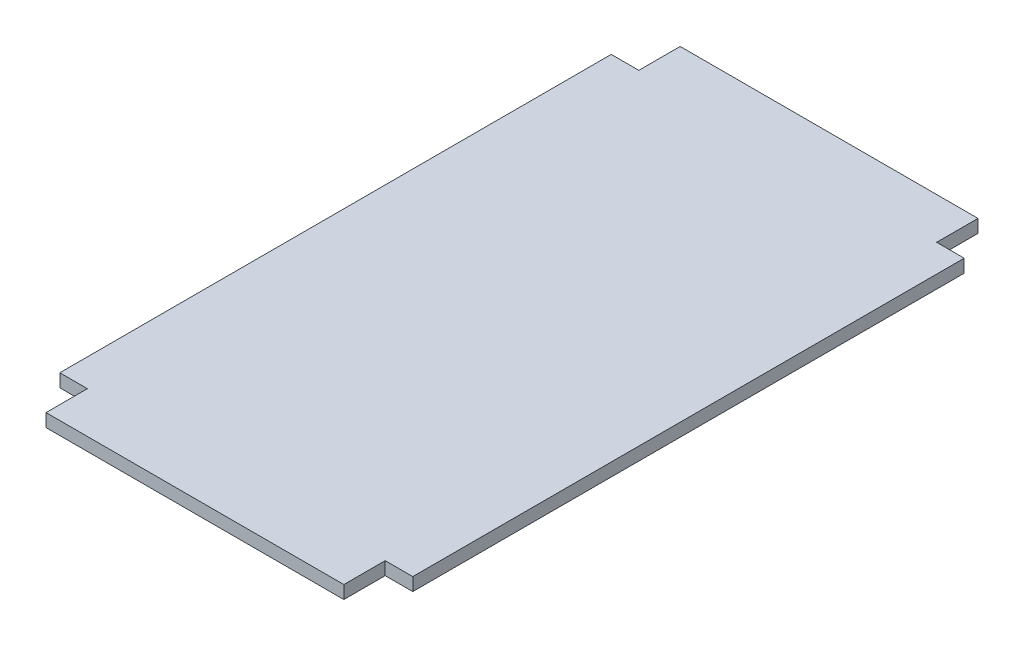
ISO-10303-21;
HEADER;
FILE_DESCRIPTION(('STEP AP214'),'2;1');
FILE_NAME('part.step','',(''),(''),'','','');
FILE_SCHEMA(('AUTOMOTIVE_DESIGN { 1 0 10303 214 1 1 1 1 }'));
ENDSEC;
DATA;
#1=APPLICATION_CONTEXT('core data for automotive mechanical design processes');
#2=APPLICATION_PROTOCOL_DEFINITION('international standard','automotive_design',2000,#1);
#3=PRODUCT_CONTEXT('',#1,'mechanical');
#4=PRODUCT('Part','Part','',(#3));
#5=PRODUCT_RELATED_PRODUCT_CATEGORY('part','',(#4));
#6=PRODUCT_DEFINITION_FORMATION('','',#4);
#7=PRODUCT_DEFINITION_CONTEXT('part definition',#1,'design');
#8=PRODUCT_DEFINITION('design','',#6,#7);
#9=PRODUCT_DEFINITION_SHAPE('','',#8);
#10=(LENGTH_UNIT() NAMED_UNIT(*) SI_UNIT(.MILLI.,.METRE.));
#11=(NAMED_UNIT(*) PLANE_ANGLE_UNIT() SI_UNIT($,.RADIAN.));
#12=(NAMED_UNIT(*) SI_UNIT($,.STERADIAN.) SOLID_ANGLE_UNIT());
#13=UNCERTAINTY_MEASURE_WITH_UNIT(LENGTH_MEASURE(1.E-05),#10,'distance_accuracy_value','');
#14=(GEOMETRIC_REPRESENTATION_CONTEXT(3) GLOBAL_UNCERTAINTY_ASSIGNED_CONTEXT((#13)) GLOBAL_UNIT_ASSIGNED_CONTEXT((#10,
#11,#12)) REPRESENTATION_CONTEXT('',''));
#15=CARTESIAN_POINT('',(0.,0.,0.));
#16=DIRECTION('',(0.,0.,1.));
#17=DIRECTION('',(1.,0.,0.));
#18=AXIS2_PLACEMENT_3D('',#15,#16,#17);
#19=CARTESIAN_POINT('',(34.2971374,2.9972,0.));
#20=DIRECTION('',(1.,0.,0.));
#21=DIRECTION('',(0.,0.,-1.));
#22=AXIS2_PLACEMENT_3D('',#19,#20,#21);
#23=PLANE('',#22);
#24=DIRECTION('',(0.,0.,1.));
#25=VECTOR('',#24,1.);
#26=CARTESIAN_POINT('',(34.2971374,0.,0.));
#27=LINE('',#26,#25);
#28=CARTESIAN_POINT('',(34.2971374,0.,-73.025));
#29=VERTEX_POINT('',#28);
#30=CARTESIAN_POINT('',(34.2971374,0.,-63.5));
#31=VERTEX_POINT('',#30);
#32=EDGE_CURVE('E166',#29,#31,#27,.T.);
#33=ORIENTED_EDGE('',*,*,#32,.F.);
#34=DIRECTION('',(0.,-1.,0.));
#35=VECTOR('',#34,1.);
#36=CARTESIAN_POINT('',(34.2971374,2.9972,-73.025));
#37=LINE('',#36,#35);
#38=CARTESIAN_POINT('',(34.2971374,2.9972,-73.025));
#39=VERTEX_POINT('',#38);
#40=EDGE_CURVE('E11',#39,#29,#37,.T.);
#41=ORIENTED_EDGE('',*,*,#40,.F.);
#42=DIRECTION('',(0.,0.,1.));
#43=VECTOR('',#42,1.);
#44=CARTESIAN_POINT('',(34.2971374,2.9972,0.));
#45=LINE('',#44,#43);
#46=CARTESIAN_POINT('',(34.2971374,2.9972,-63.5));
#47=VERTEX_POINT('',#46);
#48=EDGE_CURVE('E208',#39,#47,#45,.T.);
#49=ORIENTED_EDGE('',*,*,#48,.T.);
#50=DIRECTION('',(0.,-1.,0.));
#51=VECTOR('',#50,1.);
#52=CARTESIAN_POINT('',(34.2971374,2.9972,-63.5));
#53=LINE('',#52,#51);
#54=EDGE_CURVE('E104',#47,#31,#53,.T.);
#55=ORIENTED_EDGE('',*,*,#54,.T.);
#56=EDGE_LOOP('',(#33,#41,#49,#55));
#57=FACE_BOUND('',#56,.T.);
#58=ADVANCED_FACE('F41',(#57),#23,.T.);
#59=CARTESIAN_POINT('',(0.,2.9972,-73.025));
#60=DIRECTION('',(0.,0.,1.));
#61=DIRECTION('',(1.,0.,0.));
#62=AXIS2_PLACEMENT_3D('',#59,#60,#61);
#63=PLANE('',#62);
#64=DIRECTION('',(-1.,0.,0.));
#65=VECTOR('',#64,1.);
#66=CARTESIAN_POINT('',(0.,0.,-73.025));
#67=LINE('',#66,#65);
#68=CARTESIAN_POINT('',(-34.2971374,0.,-73.025));
#69=VERTEX_POINT('',#68);
#70=EDGE_CURVE('E170',#29,#69,#67,.T.);
#71=ORIENTED_EDGE('',*,*,#70,.T.);
#72=DIRECTION('',(0.,-1.,0.));
#73=VECTOR('',#72,1.);
#74=CARTESIAN_POINT('',(-34.2971374,2.9972,-73.025));
#75=LINE('',#74,#73);
#76=CARTESIAN_POINT('',(-34.2971374,2.9972,-73.025));
#77=VERTEX_POINT('',#76);
#78=EDGE_CURVE('E50',#77,#69,#75,.T.);
#79=ORIENTED_EDGE('',*,*,#78,.F.);
#80=DIRECTION('',(-1.,0.,0.));
#81=VECTOR('',#80,1.);
#82=CARTESIAN_POINT('',(0.,2.9972,-73.025));
#83=LINE('',#82,#81);
#84=EDGE_CURVE('E262',#39,#77,#83,.T.);
#85=ORIENTED_EDGE('',*,*,#84,.F.);
#86=ORIENTED_EDGE('',*,*,#40,.T.);
#87=EDGE_LOOP('',(#71,#79,#85,#86));
#88=FACE_BOUND('',#87,.T.);
#89=ADVANCED_FACE('F294',(#88),#63,.F.);
#90=CARTESIAN_POINT('',(-34.2971373999999,2.9972,0.));
#91=DIRECTION('',(1.,0.,0.));
#92=DIRECTION('',(0.,0.,-1.));
#93=AXIS2_PLACEMENT_3D('',#90,#91,#92);
#94=PLANE('',#93);
#95=DIRECTION('',(0.,0.,1.));
#96=VECTOR('',#95,1.);
#97=CARTESIAN_POINT('',(-34.2971373999999,0.,0.));
#98=LINE('',#97,#96);
#99=CARTESIAN_POINT('',(-34.2971374,0.,-63.5));
#100=VERTEX_POINT('',#99);
#101=EDGE_CURVE('E173',#69,#100,#98,.T.);
#102=ORIENTED_EDGE('',*,*,#101,.T.);
#103=DIRECTION('',(0.,-1.,0.));
#104=VECTOR('',#103,1.);
#105=CARTESIAN_POINT('',(-34.2971374,2.9972,-63.5));
#106=LINE('',#105,#104);
#107=CARTESIAN_POINT('',(-34.2971374,2.9972,-63.5));
#108=VERTEX_POINT('',#107);
#109=EDGE_CURVE('E230',#108,#100,#106,.T.);
#110=ORIENTED_EDGE('',*,*,#109,.F.);
#111=DIRECTION('',(0.,0.,1.));
#112=VECTOR('',#111,1.);
#113=CARTESIAN_POINT('',(-34.2971373999999,2.9972,0.));
#114=LINE('',#113,#112);
#115=EDGE_CURVE('E240',#77,#108,#114,.T.);
#116=ORIENTED_EDGE('',*,*,#115,.F.);
#117=ORIENTED_EDGE('',*,*,#78,.T.);
#118=EDGE_LOOP('',(#102,#110,#116,#117));
#119=FACE_BOUND('',#118,.T.);
#120=ADVANCED_FACE('F238',(#119),#94,.F.);
#121=CARTESIAN_POINT('',(0.,2.9972,-63.5));
#122=DIRECTION('',(0.,0.,-1.));
#123=DIRECTION('',(-1.,0.,0.));
#124=AXIS2_PLACEMENT_3D('',#121,#122,#123);
#125=PLANE('',#124);
#126=DIRECTION('',(1.,0.,0.));
#127=VECTOR('',#126,1.);
#128=CARTESIAN_POINT('',(0.,0.,-63.5));
#129=LINE('',#128,#127);
#130=CARTESIAN_POINT('',(-40.6471374,0.,-63.5));
#131=VERTEX_POINT('',#130);
#132=EDGE_CURVE('E177',#131,#100,#129,.T.);
#133=ORIENTED_EDGE('',*,*,#132,.F.);
#134=DIRECTION('',(0.,-1.,0.));
#135=VECTOR('',#134,1.);
#136=CARTESIAN_POINT('',(-40.6471374,2.9972,-63.5));
#137=LINE('',#136,#135);
#138=CARTESIAN_POINT('',(-40.6471374,2.9972,-63.5));
#139=VERTEX_POINT('',#138);
#140=EDGE_CURVE('E227',#139,#131,#137,.T.);
#141=ORIENTED_EDGE('',*,*,#140,.F.);
#142=DIRECTION('',(1.,0.,0.));
#143=VECTOR('',#142,1.);
#144=CARTESIAN_POINT('',(0.,2.9972,-63.5));
#145=LINE('',#144,#143);
#146=EDGE_CURVE('E252',#139,#108,#145,.T.);
#147=ORIENTED_EDGE('',*,*,#146,.T.);
#148=ORIENTED_EDGE('',*,*,#109,.T.);
#149=EDGE_LOOP('',(#133,#141,#147,#148));
#150=FACE_BOUND('',#149,.T.);
#151=ADVANCED_FACE('F249',(#150),#125,.T.);
#152=CARTESIAN_POINT('',(-40.6471374,2.9972,0.));
#153=DIRECTION('',(-1.,0.,0.));
#154=DIRECTION('',(0.,0.,1.));
#155=AXIS2_PLACEMENT_3D('',#152,#153,#154);
#156=PLANE('',#155);
#157=DIRECTION('',(0.,0.,-1.));
#158=VECTOR('',#157,1.);
#159=CARTESIAN_POINT('',(-40.6471374,0.,0.));
#160=LINE('',#159,#158);
#161=CARTESIAN_POINT('',(-40.6471374,0.,63.5));
#162=VERTEX_POINT('',#161);
#163=EDGE_CURVE('E181',#162,#131,#160,.T.);
#164=ORIENTED_EDGE('',*,*,#163,.F.);
#165=DIRECTION('',(0.,-1.,0.));
#166=VECTOR('',#165,1.);
#167=CARTESIAN_POINT('',(-40.6471374,2.9972,63.5));
#168=LINE('',#167,#166);
#169=CARTESIAN_POINT('',(-40.6471374,2.9972,63.5));
#170=VERTEX_POINT('',#169);
#171=EDGE_CURVE('E224',#170,#162,#168,.T.);
#172=ORIENTED_EDGE('',*,*,#171,.F.);
#173=DIRECTION('',(0.,0.,-1.));
#174=VECTOR('',#173,1.);
#175=CARTESIAN_POINT('',(-40.6471374,2.9972,0.));
#176=LINE('',#175,#174);
#177=EDGE_CURVE('E256',#170,#139,#176,.T.);
#178=ORIENTED_EDGE('',*,*,#177,.T.);
#179=ORIENTED_EDGE('',*,*,#140,.T.);
#180=EDGE_LOOP('',(#164,#172,#178,#179));
#181=FACE_BOUND('',#180,.T.);
#182=ADVANCED_FACE('F364',(#181),#156,.T.);
#183=CARTESIAN_POINT('',(0.,2.9972,63.5));
#184=DIRECTION('',(0.,0.,-1.));
#185=DIRECTION('',(-1.,0.,0.));
#186=AXIS2_PLACEMENT_3D('',#183,#184,#185);
#187=PLANE('',#186);
#188=DIRECTION('',(1.,0.,0.));
#189=VECTOR('',#188,1.);
#190=CARTESIAN_POINT('',(0.,0.,63.5));
#191=LINE('',#190,#189);
#192=CARTESIAN_POINT('',(-34.2971373999999,0.,63.5));
#193=VERTEX_POINT('',#192);
#194=EDGE_CURVE('E185',#162,#193,#191,.T.);
#195=ORIENTED_EDGE('',*,*,#194,.T.);
#196=DIRECTION('',(0.,-1.,0.));
#197=VECTOR('',#196,1.);
#198=CARTESIAN_POINT('',(-34.2971373999999,2.9972,63.5));
#199=LINE('',#198,#197);
#200=CARTESIAN_POINT('',(-34.2971373999999,2.9972,63.5));
#201=VERTEX_POINT('',#200);
#202=EDGE_CURVE('E221',#201,#193,#199,.T.);
#203=ORIENTED_EDGE('',*,*,#202,.F.);
#204=DIRECTION('',(1.,0.,0.));
#205=VECTOR('',#204,1.);
#206=CARTESIAN_POINT('',(0.,2.9972,63.5));
#207=LINE('',#206,#205);
#208=EDGE_CURVE('E260',#170,#201,#207,.T.);
#209=ORIENTED_EDGE('',*,*,#208,.F.);
#210=ORIENTED_EDGE('',*,*,#171,.T.);
#211=EDGE_LOOP('',(#195,#203,#209,#210));
#212=FACE_BOUND('',#211,.T.);
#213=ADVANCED_FACE('F355',(#212),#187,.F.);
#214=CARTESIAN_POINT('',(-34.2971373999999,2.9972,0.));
#215=DIRECTION('',(-1.,0.,0.));
#216=DIRECTION('',(0.,0.,1.));
#217=AXIS2_PLACEMENT_3D('',#214,#215,#216);
#218=PLANE('',#217);
#219=DIRECTION('',(0.,0.,-1.));
#220=VECTOR('',#219,1.);
#221=CARTESIAN_POINT('',(-34.2971373999999,0.,0.));
#222=LINE('',#221,#220);
#223=CARTESIAN_POINT('',(-34.2971373999999,0.,73.025));
#224=VERTEX_POINT('',#223);
#225=EDGE_CURVE('E189',#224,#193,#222,.T.);
#226=ORIENTED_EDGE('',*,*,#225,.F.);
#227=DIRECTION('',(0.,-1.,0.));
#228=VECTOR('',#227,1.);
#229=CARTESIAN_POINT('',(-34.2971373999999,2.9972,73.025));
#230=LINE('',#229,#228);
#231=CARTESIAN_POINT('',(-34.2971373999999,2.9972,73.025));
#232=VERTEX_POINT('',#231);
#233=EDGE_CURVE('E218',#232,#224,#230,.T.);
#234=ORIENTED_EDGE('',*,*,#233,.F.);
#235=DIRECTION('',(0.,0.,-1.));
#236=VECTOR('',#235,1.);
#237=CARTESIAN_POINT('',(-34.2971373999999,2.9972,0.));
#238=LINE('',#237,#236);
#239=EDGE_CURVE('E268',#232,#201,#238,.T.);
#240=ORIENTED_EDGE('',*,*,#239,.T.);
#241=ORIENTED_EDGE('',*,*,#202,.T.);
#242=EDGE_LOOP('',(#226,#234,#240,#241));
#243=FACE_BOUND('',#242,.T.);
#244=ADVANCED_FACE('F281',(#243),#218,.T.);
#245=CARTESIAN_POINT('',(0.,2.9972,73.025));
#246=DIRECTION('',(0.,0.,1.));
#247=DIRECTION('',(1.,0.,0.));
#248=AXIS2_PLACEMENT_3D('',#245,#246,#247);
#249=PLANE('',#248);
#250=DIRECTION('',(-1.,0.,0.));
#251=VECTOR('',#250,1.);
#252=CARTESIAN_POINT('',(0.,0.,73.025));
#253=LINE('',#252,#251);
#254=CARTESIAN_POINT('',(34.2971374,0.,73.025));
#255=VERTEX_POINT('',#254);
#256=EDGE_CURVE('E193',#255,#224,#253,.T.);
#257=ORIENTED_EDGE('',*,*,#256,.F.);
#258=DIRECTION('',(0.,-1.,0.));
#259=VECTOR('',#258,1.);
#260=CARTESIAN_POINT('',(34.2971374,2.9972,73.025));
#261=LINE('',#260,#259);
#262=CARTESIAN_POINT('',(34.2971374,2.9972,73.025));
#263=VERTEX_POINT('',#262);
#264=EDGE_CURVE('E215',#263,#255,#261,.T.);
#265=ORIENTED_EDGE('',*,*,#264,.F.);
#266=DIRECTION('',(-1.,0.,0.));
#267=VECTOR('',#266,1.);
#268=CARTESIAN_POINT('',(0.,2.9972,73.025));
#269=LINE('',#268,#267);
#270=EDGE_CURVE('E160',#263,#232,#269,.T.);
#271=ORIENTED_EDGE('',*,*,#270,.T.);
#272=ORIENTED_EDGE('',*,*,#233,.T.);
#273=EDGE_LOOP('',(#257,#265,#271,#272));
#274=FACE_BOUND('',#273,.T.);
#275=ADVANCED_FACE('F275',(#274),#249,.T.);
#276=CARTESIAN_POINT('',(34.2971374,2.9972,0.));
#277=DIRECTION('',(-1.,0.,0.));
#278=DIRECTION('',(0.,0.,1.));
#279=AXIS2_PLACEMENT_3D('',#276,#277,#278);
#280=PLANE('',#279);
#281=DIRECTION('',(0.,0.,-1.));
#282=VECTOR('',#281,1.);
#283=CARTESIAN_POINT('',(34.2971374,0.,0.));
#284=LINE('',#283,#282);
#285=CARTESIAN_POINT('',(34.2971374,0.,63.5));
#286=VERTEX_POINT('',#285);
#287=EDGE_CURVE('E197',#255,#286,#284,.T.);
#288=ORIENTED_EDGE('',*,*,#287,.T.);
#289=DIRECTION('',(0.,-1.,0.));
#290=VECTOR('',#289,1.);
#291=CARTESIAN_POINT('',(34.2971374,2.9972,63.5));
#292=LINE('',#291,#290);
#293=CARTESIAN_POINT('',(34.2971374,2.9972,63.5));
#294=VERTEX_POINT('',#293);
#295=EDGE_CURVE('E145',#294,#286,#292,.T.);
#296=ORIENTED_EDGE('',*,*,#295,.F.);
#297=DIRECTION('',(0.,0.,-1.));
#298=VECTOR('',#297,1.);
#299=CARTESIAN_POINT('',(34.2971374,2.9972,0.));
#300=LINE('',#299,#298);
#301=EDGE_CURVE('E155',#263,#294,#300,.T.);
#302=ORIENTED_EDGE('',*,*,#301,.F.);
#303=ORIENTED_EDGE('',*,*,#264,.T.);
#304=EDGE_LOOP('',(#288,#296,#302,#303));
#305=FACE_BOUND('',#304,.T.);
#306=ADVANCED_FACE('F284',(#305),#280,.F.);
#307=CARTESIAN_POINT('',(0.,2.9972,63.5));
#308=DIRECTION('',(0.,0.,1.));
#309=DIRECTION('',(1.,0.,0.));
#310=AXIS2_PLACEMENT_3D('',#307,#308,#309);
#311=PLANE('',#310);
#312=DIRECTION('',(-1.,0.,0.));
#313=VECTOR('',#312,1.);
#314=CARTESIAN_POINT('',(0.,0.,63.5));
#315=LINE('',#314,#313);
#316=CARTESIAN_POINT('',(40.6471374,0.,63.5));
#317=VERTEX_POINT('',#316);
#318=EDGE_CURVE('E143',#317,#286,#315,.T.);
#319=ORIENTED_EDGE('',*,*,#318,.F.);
#320=DIRECTION('',(0.,-1.,0.));
#321=VECTOR('',#320,1.);
#322=CARTESIAN_POINT('',(40.6471374,2.9972,63.5));
#323=LINE('',#322,#321);
#324=CARTESIAN_POINT('',(40.6471374,2.9972,63.5));
#325=VERTEX_POINT('',#324);
#326=EDGE_CURVE('E137',#325,#317,#323,.T.);
#327=ORIENTED_EDGE('',*,*,#326,.F.);
#328=DIRECTION('',(-1.,0.,0.));
#329=VECTOR('',#328,1.);
#330=CARTESIAN_POINT('',(0.,2.9972,63.5));
#331=LINE('',#330,#329);
#332=EDGE_CURVE('E141',#325,#294,#331,.T.);
#333=ORIENTED_EDGE('',*,*,#332,.T.);
#334=ORIENTED_EDGE('',*,*,#295,.T.);
#335=EDGE_LOOP('',(#319,#327,#333,#334));
#336=FACE_BOUND('',#335,.T.);
#337=ADVANCED_FACE('F139',(#336),#311,.T.);
#338=CARTESIAN_POINT('',(40.6471374,2.9972,0.));
#339=DIRECTION('',(-1.,0.,0.));
#340=DIRECTION('',(0.,0.,1.));
#341=AXIS2_PLACEMENT_3D('',#338,#339,#340);
#342=PLANE('',#341);
#343=DIRECTION('',(0.,0.,-1.));
#344=VECTOR('',#343,1.);
#345=CARTESIAN_POINT('',(40.6471374,0.,0.));
#346=LINE('',#345,#344);
#347=CARTESIAN_POINT('',(40.6471374,0.,-63.5));
#348=VERTEX_POINT('',#347);
#349=EDGE_CURVE('E97',#317,#348,#346,.T.);
#350=ORIENTED_EDGE('',*,*,#349,.T.);
#351=DIRECTION('',(0.,-1.,0.));
#352=VECTOR('',#351,1.);
#353=CARTESIAN_POINT('',(40.6471374,2.9972,-63.5));
#354=LINE('',#353,#352);
#355=CARTESIAN_POINT('',(40.6471374,2.9972,-63.5));
#356=VERTEX_POINT('',#355);
#357=EDGE_CURVE('E146',#356,#348,#354,.T.);
#358=ORIENTED_EDGE('',*,*,#357,.F.);
#359=DIRECTION('',(0.,0.,-1.));
#360=VECTOR('',#359,1.);
#361=CARTESIAN_POINT('',(40.6471374,2.9972,0.));
#362=LINE('',#361,#360);
#363=EDGE_CURVE('E148',#325,#356,#362,.T.);
#364=ORIENTED_EDGE('',*,*,#363,.F.);
#365=ORIENTED_EDGE('',*,*,#326,.T.);
#366=EDGE_LOOP('',(#350,#358,#364,#365));
#367=FACE_BOUND('',#366,.T.);
#368=ADVANCED_FACE('F149',(#367),#342,.F.);
#369=CARTESIAN_POINT('',(0.,2.9972,-63.5));
#370=DIRECTION('',(0.,0.,1.));
#371=DIRECTION('',(1.,0.,0.));
#372=AXIS2_PLACEMENT_3D('',#369,#370,#371);
#373=PLANE('',#372);
#374=DIRECTION('',(-1.,0.,0.));
#375=VECTOR('',#374,1.);
#376=CARTESIAN_POINT('',(0.,0.,-63.5));
#377=LINE('',#376,#375);
#378=EDGE_CURVE('E205',#348,#31,#377,.T.);
#379=ORIENTED_EDGE('',*,*,#378,.T.);
#380=ORIENTED_EDGE('',*,*,#54,.F.);
#381=DIRECTION('',(-1.,0.,0.));
#382=VECTOR('',#381,1.);
#383=CARTESIAN_POINT('',(0.,2.9972,-63.5));
#384=LINE('',#383,#382);
#385=EDGE_CURVE('E58',#356,#47,#384,.T.);
#386=ORIENTED_EDGE('',*,*,#385,.F.);
#387=ORIENTED_EDGE('',*,*,#357,.T.);
#388=EDGE_LOOP('',(#379,#380,#386,#387));
#389=FACE_BOUND('',#388,.T.);
#390=ADVANCED_FACE('F300',(#389),#373,.F.);
#391=CARTESIAN_POINT('',(0.,2.9972,0.));
#392=DIRECTION('',(0.,1.,0.));
#393=DIRECTION('',(0.,0.,1.));
#394=AXIS2_PLACEMENT_3D('',#391,#392,#393);
#395=PLANE('',#394);
#396=ORIENTED_EDGE('',*,*,#48,.F.);
#397=ORIENTED_EDGE('',*,*,#84,.T.);
#398=ORIENTED_EDGE('',*,*,#115,.T.);
#399=ORIENTED_EDGE('',*,*,#146,.F.);
#400=ORIENTED_EDGE('',*,*,#177,.F.);
#401=ORIENTED_EDGE('',*,*,#208,.T.);
#402=ORIENTED_EDGE('',*,*,#239,.F.);
#403=ORIENTED_EDGE('',*,*,#270,.F.);
#404=ORIENTED_EDGE('',*,*,#301,.T.);
#405=ORIENTED_EDGE('',*,*,#332,.F.);
#406=ORIENTED_EDGE('',*,*,#363,.T.);
#407=ORIENTED_EDGE('',*,*,#385,.T.);
#408=EDGE_LOOP('',(#396,#397,#398,#399,#400,#401,#402,#403,#404,#405,#406,#407));
#409=FACE_BOUND('',#408,.T.);
#410=ADVANCED_FACE('F152',(#409),#395,.T.);
#411=CARTESIAN_POINT('',(0.,0.,0.));
#412=DIRECTION('',(0.,1.,0.));
#413=DIRECTION('',(0.,0.,1.));
#414=AXIS2_PLACEMENT_3D('',#411,#412,#413);
#415=PLANE('',#414);
#416=ORIENTED_EDGE('',*,*,#32,.T.);
#417=ORIENTED_EDGE('',*,*,#378,.F.);
#418=ORIENTED_EDGE('',*,*,#349,.F.);
#419=ORIENTED_EDGE('',*,*,#318,.T.);
#420=ORIENTED_EDGE('',*,*,#287,.F.);
#421=ORIENTED_EDGE('',*,*,#256,.T.);
#422=ORIENTED_EDGE('',*,*,#225,.T.);
#423=ORIENTED_EDGE('',*,*,#194,.F.);
#424=ORIENTED_EDGE('',*,*,#163,.T.);
#425=ORIENTED_EDGE('',*,*,#132,.T.);
#426=ORIENTED_EDGE('',*,*,#101,.F.);
#427=ORIENTED_EDGE('',*,*,#70,.F.);
#428=EDGE_LOOP('',(#416,#417,#418,#419,#420,#421,#422,#423,#424,#425,#426,#427));
#429=FACE_BOUND('',#428,.T.);
#430=ADVANCED_FACE('F244',(#429),#415,.F.);
#431=CLOSED_SHELL('',(#58,#89,#120,#151,#182,#213,#244,#275,#306,#337,#368,#390,#410,#430));
#432=MANIFOLD_SOLID_BREP('B2',#431);
#433=ADVANCED_BREP_SHAPE_REPRESENTATION('',(#18,#432),#14);
#434=SHAPE_DEFINITION_REPRESENTATION(#9,#433);
ENDSEC;
END-ISO-10303-21;
